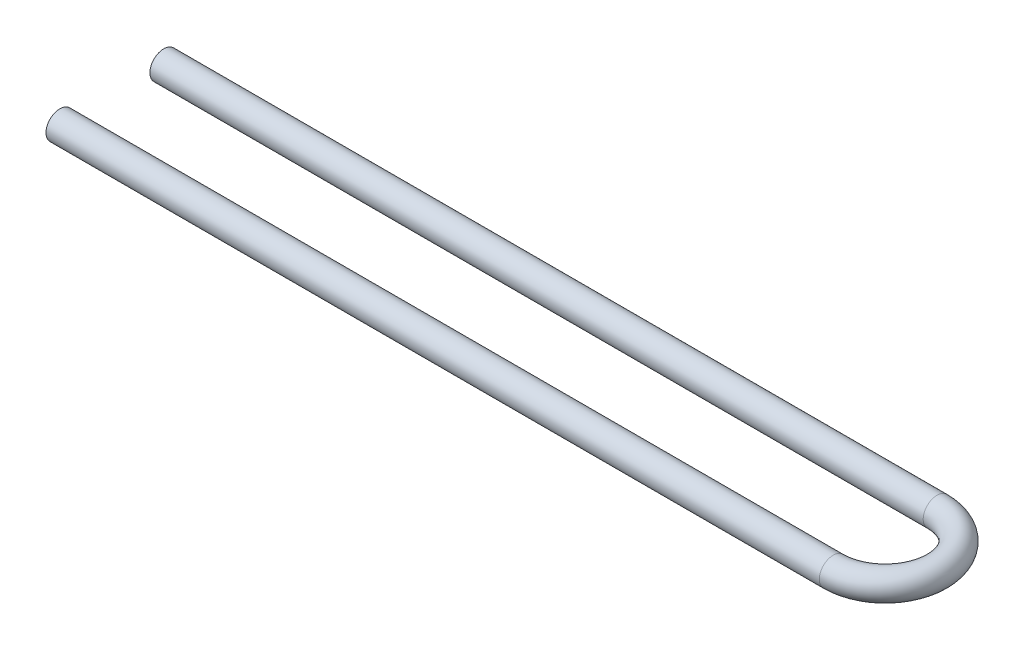
ISO-10303-21;
HEADER;
FILE_DESCRIPTION(('STEP AP214'),'2;1');
FILE_NAME('part.step','',(''),(''),'','','');
FILE_SCHEMA(('AUTOMOTIVE_DESIGN { 1 0 10303 214 1 1 1 1 }'));
ENDSEC;
DATA;
#1=APPLICATION_CONTEXT('core data for automotive mechanical design processes');
#2=APPLICATION_PROTOCOL_DEFINITION('international standard','automotive_design',2000,#1);
#3=PRODUCT_CONTEXT('',#1,'mechanical');
#4=PRODUCT('Part','Part','',(#3));
#5=PRODUCT_RELATED_PRODUCT_CATEGORY('part','',(#4));
#6=PRODUCT_DEFINITION_FORMATION('','',#4);
#7=PRODUCT_DEFINITION_CONTEXT('part definition',#1,'design');
#8=PRODUCT_DEFINITION('design','',#6,#7);
#9=PRODUCT_DEFINITION_SHAPE('','',#8);
#10=(LENGTH_UNIT() NAMED_UNIT(*) SI_UNIT(.MILLI.,.METRE.));
#11=(NAMED_UNIT(*) PLANE_ANGLE_UNIT() SI_UNIT($,.RADIAN.));
#12=(NAMED_UNIT(*) SI_UNIT($,.STERADIAN.) SOLID_ANGLE_UNIT());
#13=UNCERTAINTY_MEASURE_WITH_UNIT(LENGTH_MEASURE(1.E-05),#10,'distance_accuracy_value','');
#14=(GEOMETRIC_REPRESENTATION_CONTEXT(3) GLOBAL_UNCERTAINTY_ASSIGNED_CONTEXT((#13)) GLOBAL_UNIT_ASSIGNED_CONTEXT((#10,
#11,#12)) REPRESENTATION_CONTEXT('',''));
#15=CARTESIAN_POINT('',(0.,0.,0.));
#16=DIRECTION('',(0.,0.,1.));
#17=DIRECTION('',(1.,0.,0.));
#18=AXIS2_PLACEMENT_3D('',#15,#16,#17);
#19=CARTESIAN_POINT('',(0.,0.,0.));
#20=DIRECTION('',(1.,0.,0.));
#21=DIRECTION('',(0.,0.,-1.));
#22=AXIS2_PLACEMENT_3D('',#19,#20,#21);
#23=PLANE('',#22);
#24=CARTESIAN_POINT('',(0.,0.,0.));
#25=DIRECTION('',(1.,0.,0.));
#26=DIRECTION('',(0.,0.,-1.));
#27=AXIS2_PLACEMENT_3D('',#24,#25,#26);
#28=CIRCLE('',#27,1.);
#29=CARTESIAN_POINT('',(0.,0.,-1.));
#30=VERTEX_POINT('',#29);
#31=EDGE_CURVE('E44',#30,#30,#28,.T.);
#32=ORIENTED_EDGE('',*,*,#31,.F.);
#33=EDGE_LOOP('',(#32));
#34=FACE_BOUND('',#33,.T.);
#35=ADVANCED_FACE('F32',(#34),#23,.F.);
#36=CARTESIAN_POINT('',(0.,0.,7.49999999999998));
#37=DIRECTION('',(-1.,0.,0.));
#38=DIRECTION('',(0.,0.,1.));
#39=AXIS2_PLACEMENT_3D('',#36,#37,#38);
#40=PLANE('',#39);
#41=CARTESIAN_POINT('',(0.,0.,7.49999999999998));
#42=DIRECTION('',(-1.,0.,0.));
#43=DIRECTION('',(0.,0.,1.));
#44=AXIS2_PLACEMENT_3D('',#41,#42,#43);
#45=CIRCLE('',#44,1.);
#46=CARTESIAN_POINT('',(0.,0.,8.49999999999998));
#47=VERTEX_POINT('',#46);
#48=EDGE_CURVE('E11',#47,#47,#45,.T.);
#49=ORIENTED_EDGE('',*,*,#48,.T.);
#50=EDGE_LOOP('',(#49));
#51=FACE_BOUND('',#50,.T.);
#52=ADVANCED_FACE('F47',(#51),#40,.T.);
#53=CARTESIAN_POINT('',(0.,0.,0.));
#54=DIRECTION('',(1.,0.,0.));
#55=DIRECTION('',(0.,0.,-1.));
#56=AXIS2_PLACEMENT_3D('',#53,#54,#55);
#57=CYLINDRICAL_SURFACE('',#56,1.);
#58=CARTESIAN_POINT('',(55.82324902,0.,0.));
#59=DIRECTION('',(1.,0.,0.));
#60=DIRECTION('',(0.,0.,-1.));
#61=AXIS2_PLACEMENT_3D('',#58,#59,#60);
#62=CIRCLE('',#61,1.);
#63=CARTESIAN_POINT('',(55.82324902,0.,-1.));
#64=VERTEX_POINT('',#63);
#65=EDGE_CURVE('E57',#64,#64,#62,.T.);
#66=ORIENTED_EDGE('',*,*,#65,.F.);
#67=EDGE_LOOP('',(#66));
#68=FACE_BOUND('',#67,.T.);
#69=ORIENTED_EDGE('',*,*,#31,.T.);
#70=EDGE_LOOP('',(#69));
#71=FACE_BOUND('',#70,.T.);
#72=ADVANCED_FACE('F62',(#68,#71),#57,.T.);
#73=CARTESIAN_POINT('',(55.82324902,0.,3.74999999999999));
#74=DIRECTION('',(0.,-1.,0.));
#75=DIRECTION('',(0.,0.,-1.));
#76=AXIS2_PLACEMENT_3D('',#73,#74,#75);
#77=TOROIDAL_SURFACE('',#76,3.74999999999999,1.);
#78=CARTESIAN_POINT('',(55.8232490200001,0.,7.49999999999998));
#79=DIRECTION('',(-1.,0.,0.));
#80=DIRECTION('',(0.,0.,1.));
#81=AXIS2_PLACEMENT_3D('',#78,#79,#80);
#82=CIRCLE('',#81,1.);
#83=CARTESIAN_POINT('',(55.8232490200001,0.,8.49999999999998));
#84=VERTEX_POINT('',#83);
#85=EDGE_CURVE('E39',#84,#84,#82,.T.);
#86=CARTESIAN_POINT('',(55.82324902,0.,3.74999999999999));
#87=DIRECTION('',(0.,-1.,0.));
#88=DIRECTION('',(0.,0.,-1.));
#89=AXIS2_PLACEMENT_3D('',#86,#87,#88);
#90=CIRCLE('',#89,4.74999999999999);
#91=EDGE_CURVE('',#64,#84,#90,.T.);
#92=ORIENTED_EDGE('',*,*,#65,.T.);
#93=ORIENTED_EDGE('',*,*,#85,.F.);
#94=ORIENTED_EDGE('',*,*,#91,.T.);
#95=ORIENTED_EDGE('',*,*,#91,.F.);
#96=EDGE_LOOP('',(#92,#94,#93,#95));
#97=FACE_BOUND('',#96,.T.);
#98=ADVANCED_FACE('F52',(#97),#77,.T.);
#99=CARTESIAN_POINT('',(55.8232490200001,0.,7.49999999999998));
#100=DIRECTION('',(-1.,0.,0.));
#101=DIRECTION('',(0.,0.,1.));
#102=AXIS2_PLACEMENT_3D('',#99,#100,#101);
#103=CYLINDRICAL_SURFACE('',#102,1.);
#104=ORIENTED_EDGE('',*,*,#48,.F.);
#105=EDGE_LOOP('',(#104));
#106=FACE_BOUND('',#105,.T.);
#107=ORIENTED_EDGE('',*,*,#85,.T.);
#108=EDGE_LOOP('',(#107));
#109=FACE_BOUND('',#108,.T.);
#110=ADVANCED_FACE('F49',(#106,#109),#103,.T.);
#111=CLOSED_SHELL('',(#35,#52,#72,#98,#110));
#112=MANIFOLD_SOLID_BREP('B2',#111);
#113=ADVANCED_BREP_SHAPE_REPRESENTATION('',(#18,#112),#14);
#114=SHAPE_DEFINITION_REPRESENTATION(#9,#113);
ENDSEC;
END-ISO-10303-21;
